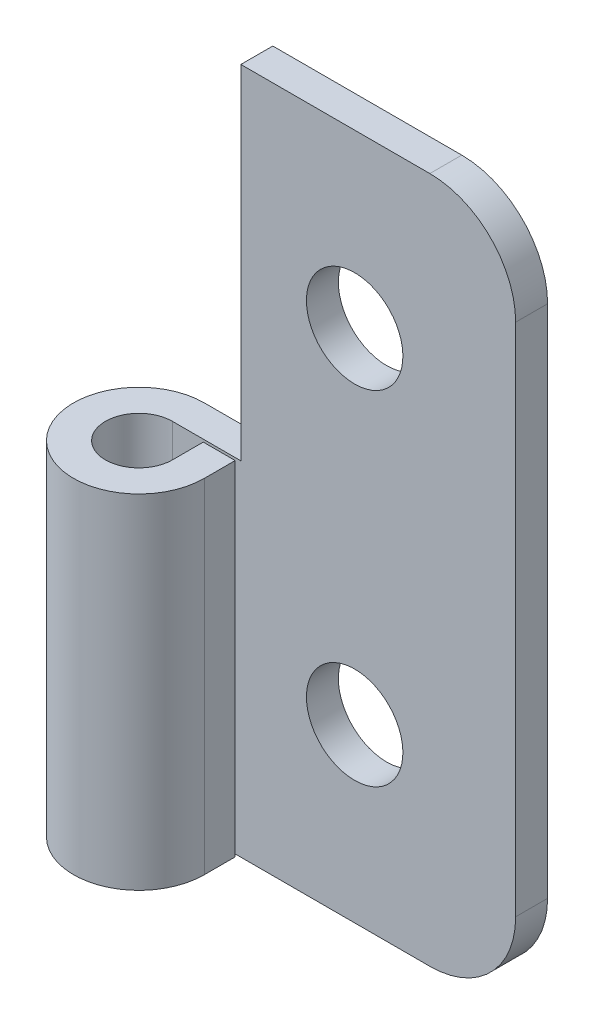
ISO-10303-21;
HEADER;
FILE_DESCRIPTION(('STEP AP214'),'2;1');
FILE_NAME('part.step','',(''),(''),'','','');
FILE_SCHEMA(('AUTOMOTIVE_DESIGN { 1 0 10303 214 1 1 1 1 }'));
ENDSEC;
DATA;
#1=APPLICATION_CONTEXT('core data for automotive mechanical design processes');
#2=APPLICATION_PROTOCOL_DEFINITION('international standard','automotive_design',2000,#1);
#3=PRODUCT_CONTEXT('',#1,'mechanical');
#4=PRODUCT('Part','Part','',(#3));
#5=PRODUCT_RELATED_PRODUCT_CATEGORY('part','',(#4));
#6=PRODUCT_DEFINITION_FORMATION('','',#4);
#7=PRODUCT_DEFINITION_CONTEXT('part definition',#1,'design');
#8=PRODUCT_DEFINITION('design','',#6,#7);
#9=PRODUCT_DEFINITION_SHAPE('','',#8);
#10=(LENGTH_UNIT() NAMED_UNIT(*) SI_UNIT(.MILLI.,.METRE.));
#11=(NAMED_UNIT(*) PLANE_ANGLE_UNIT() SI_UNIT($,.RADIAN.));
#12=(NAMED_UNIT(*) SI_UNIT($,.STERADIAN.) SOLID_ANGLE_UNIT());
#13=UNCERTAINTY_MEASURE_WITH_UNIT(LENGTH_MEASURE(1.E-05),#10,'distance_accuracy_value','');
#14=(GEOMETRIC_REPRESENTATION_CONTEXT(3) GLOBAL_UNCERTAINTY_ASSIGNED_CONTEXT((#13)) GLOBAL_UNIT_ASSIGNED_CONTEXT((#10,
#11,#12)) REPRESENTATION_CONTEXT('',''));
#15=CARTESIAN_POINT('',(0.,0.,0.));
#16=DIRECTION('',(0.,0.,1.));
#17=DIRECTION('',(1.,0.,0.));
#18=AXIS2_PLACEMENT_3D('',#15,#16,#17);
#19=CARTESIAN_POINT('',(4.8387,-25.4,2.55270000000001));
#20=DIRECTION('',(1.,0.,0.));
#21=DIRECTION('',(0.,0.,1.));
#22=AXIS2_PLACEMENT_3D('',#19,#20,#21);
#23=PLANE('',#22);
#24=DIRECTION('',(0.,0.,1.));
#25=VECTOR('',#24,1.);
#26=CARTESIAN_POINT('',(4.8387,0.,10.9397930174127));
#27=LINE('',#26,#25);
#28=CARTESIAN_POINT('',(4.8387,0.,2.55270000000001));
#29=VERTEX_POINT('',#28);
#30=CARTESIAN_POINT('',(4.8387,0.,4.8387));
#31=VERTEX_POINT('',#30);
#32=EDGE_CURVE('E298',#29,#31,#27,.T.);
#33=ORIENTED_EDGE('',*,*,#32,.T.);
#34=DIRECTION('',(0.,1.,0.));
#35=VECTOR('',#34,1.);
#36=CARTESIAN_POINT('',(4.8387,-25.4,4.8387));
#37=LINE('',#36,#35);
#38=CARTESIAN_POINT('',(4.83870000000001,-25.4,4.8387));
#39=VERTEX_POINT('',#38);
#40=EDGE_CURVE('E267',#39,#31,#37,.T.);
#41=ORIENTED_EDGE('',*,*,#40,.F.);
#42=DIRECTION('',(0.,0.,-1.));
#43=VECTOR('',#42,1.);
#44=CARTESIAN_POINT('',(4.83870000000002,-25.4,3.43572275257362));
#45=LINE('',#44,#43);
#46=CARTESIAN_POINT('',(4.83870000000001,-25.4,2.55270000000001));
#47=VERTEX_POINT('',#46);
#48=EDGE_CURVE('E232',#47,#39,#45,.F.);
#49=ORIENTED_EDGE('',*,*,#48,.F.);
#50=DIRECTION('',(0.,1.,0.));
#51=VECTOR('',#50,1.);
#52=CARTESIAN_POINT('',(4.8387,-25.4,2.55270000000001));
#53=LINE('',#52,#51);
#54=EDGE_CURVE('E276',#29,#47,#53,.F.);
#55=ORIENTED_EDGE('',*,*,#54,.F.);
#56=EDGE_LOOP('',(#33,#41,#49,#55));
#57=FACE_BOUND('',#56,.T.);
#58=ADVANCED_FACE('F41',(#57),#23,.T.);
#59=CARTESIAN_POINT('',(0.,-25.4,4.8387));
#60=DIRECTION('',(0.,1.,0.));
#61=DIRECTION('',(-1.,0.,0.));
#62=AXIS2_PLACEMENT_3D('',#59,#60,#61);
#63=CYLINDRICAL_SURFACE('',#62,4.8387);
#64=CARTESIAN_POINT('',(0.,0.,4.8387));
#65=DIRECTION('',(0.,1.,0.));
#66=DIRECTION('',(-1.,0.,0.));
#67=AXIS2_PLACEMENT_3D('',#64,#65,#66);
#68=CIRCLE('',#67,4.8387);
#69=CARTESIAN_POINT('',(0.,0.,0.));
#70=VERTEX_POINT('',#69);
#71=EDGE_CURVE('E309',#31,#70,#68,.F.);
#72=ORIENTED_EDGE('',*,*,#71,.T.);
#73=DIRECTION('',(0.,1.,0.));
#74=VECTOR('',#73,1.);
#75=CARTESIAN_POINT('',(0.,-25.4,0.));
#76=LINE('',#75,#74);
#77=CARTESIAN_POINT('',(0.,-25.4,0.));
#78=VERTEX_POINT('',#77);
#79=EDGE_CURVE('E279',#78,#70,#76,.T.);
#80=ORIENTED_EDGE('',*,*,#79,.F.);
#81=CARTESIAN_POINT('',(0.,-25.4,4.8387));
#82=DIRECTION('',(0.,1.,0.));
#83=DIRECTION('',(-1.,0.,0.));
#84=AXIS2_PLACEMENT_3D('',#81,#82,#83);
#85=CIRCLE('',#84,4.8387);
#86=EDGE_CURVE('E223',#39,#78,#85,.F.);
#87=ORIENTED_EDGE('',*,*,#86,.F.);
#88=ORIENTED_EDGE('',*,*,#40,.T.);
#89=EDGE_LOOP('',(#72,#80,#87,#88));
#90=FACE_BOUND('',#89,.T.);
#91=ADVANCED_FACE('F388',(#90),#63,.T.);
#92=CARTESIAN_POINT('',(2.4765,-25.4,4.8387));
#93=DIRECTION('',(-1.,0.,0.));
#94=DIRECTION('',(0.,-1.,0.));
#95=AXIS2_PLACEMENT_3D('',#92,#93,#94);
#96=PLANE('',#95);
#97=DIRECTION('',(0.,0.,1.));
#98=VECTOR('',#97,1.);
#99=CARTESIAN_POINT('',(2.47650000000001,0.,10.9397930174127));
#100=LINE('',#99,#98);
#101=CARTESIAN_POINT('',(2.47650000000001,0.,4.8387));
#102=VERTEX_POINT('',#101);
#103=CARTESIAN_POINT('',(2.47650000000002,0.,2.55270000000001));
#104=VERTEX_POINT('',#103);
#105=EDGE_CURVE('E172',#102,#104,#100,.F.);
#106=ORIENTED_EDGE('',*,*,#105,.T.);
#107=DIRECTION('',(0.,1.,0.));
#108=VECTOR('',#107,1.);
#109=CARTESIAN_POINT('',(2.47650000000004,-25.4,2.55270000000001));
#110=LINE('',#109,#108);
#111=CARTESIAN_POINT('',(2.47650000000002,-25.4,2.55270000000001));
#112=VERTEX_POINT('',#111);
#113=EDGE_CURVE('E266',#112,#104,#110,.T.);
#114=ORIENTED_EDGE('',*,*,#113,.F.);
#115=DIRECTION('',(0.,0.,-1.));
#116=VECTOR('',#115,1.);
#117=CARTESIAN_POINT('',(2.47650000000001,-25.4,3.43572275257362));
#118=LINE('',#117,#116);
#119=CARTESIAN_POINT('',(2.47650000000001,-25.4,4.8387));
#120=VERTEX_POINT('',#119);
#121=EDGE_CURVE('E230',#120,#112,#118,.T.);
#122=ORIENTED_EDGE('',*,*,#121,.F.);
#123=DIRECTION('',(0.,-1.,0.));
#124=VECTOR('',#123,1.);
#125=CARTESIAN_POINT('',(2.4765,-25.4,4.8387));
#126=LINE('',#125,#124);
#127=EDGE_CURVE('E262',#120,#102,#126,.F.);
#128=ORIENTED_EDGE('',*,*,#127,.T.);
#129=EDGE_LOOP('',(#106,#114,#122,#128));
#130=FACE_BOUND('',#129,.T.);
#131=ADVANCED_FACE('F378',(#130),#96,.T.);
#132=CARTESIAN_POINT('',(2.47650000000005,-25.4,2.55270000000001));
#133=DIRECTION('',(0.,0.,-1.));
#134=DIRECTION('',(0.,1.,0.));
#135=AXIS2_PLACEMENT_3D('',#132,#133,#134);
#136=PLANE('',#135);
#137=DIRECTION('',(1.,0.,0.));
#138=VECTOR('',#137,1.);
#139=CARTESIAN_POINT('',(-4.8387,0.,2.55270000000001));
#140=LINE('',#139,#138);
#141=EDGE_CURVE('E294',#104,#29,#140,.T.);
#142=ORIENTED_EDGE('',*,*,#141,.T.);
#143=ORIENTED_EDGE('',*,*,#54,.T.);
#144=DIRECTION('',(1.,0.,0.));
#145=VECTOR('',#144,1.);
#146=CARTESIAN_POINT('',(6.02577724742644,-25.4,2.55270000000001));
#147=LINE('',#146,#145);
#148=EDGE_CURVE('E258',#112,#47,#147,.T.);
#149=ORIENTED_EDGE('',*,*,#148,.F.);
#150=ORIENTED_EDGE('',*,*,#113,.T.);
#151=EDGE_LOOP('',(#142,#143,#149,#150));
#152=FACE_BOUND('',#151,.T.);
#153=ADVANCED_FACE('F334',(#152),#136,.T.);
#154=CARTESIAN_POINT('',(0.,-25.4,0.));
#155=DIRECTION('',(0.,0.,-1.));
#156=DIRECTION('',(0.,1.,0.));
#157=AXIS2_PLACEMENT_3D('',#154,#155,#156);
#158=PLANE('',#157);
#159=DIRECTION('',(0.,-1.,0.));
#160=VECTOR('',#159,1.);
#161=CARTESIAN_POINT('',(25.4,-25.4,0.));
#162=LINE('',#161,#160);
#163=CARTESIAN_POINT('',(25.4,-19.05,0.));
#164=VERTEX_POINT('',#163);
#165=CARTESIAN_POINT('',(25.4,19.05,0.));
#166=VERTEX_POINT('',#165);
#167=EDGE_CURVE('E220',#164,#166,#162,.F.);
#168=ORIENTED_EDGE('',*,*,#167,.F.);
#169=CARTESIAN_POINT('',(19.05,-19.05,0.));
#170=DIRECTION('',(0.,0.,-1.));
#171=DIRECTION('',(-1.,0.,0.));
#172=AXIS2_PLACEMENT_3D('',#169,#170,#171);
#173=CIRCLE('',#172,6.35);
#174=CARTESIAN_POINT('',(19.05,-25.4,0.));
#175=VERTEX_POINT('',#174);
#176=EDGE_CURVE('E202',#164,#175,#173,.T.);
#177=ORIENTED_EDGE('',*,*,#176,.T.);
#178=DIRECTION('',(1.,0.,0.));
#179=VECTOR('',#178,1.);
#180=CARTESIAN_POINT('',(6.02577724742644,-25.4,0.));
#181=LINE('',#180,#179);
#182=EDGE_CURVE('E218',#78,#175,#181,.T.);
#183=ORIENTED_EDGE('',*,*,#182,.F.);
#184=ORIENTED_EDGE('',*,*,#79,.T.);
#185=DIRECTION('',(1.,0.,0.));
#186=VECTOR('',#185,1.);
#187=CARTESIAN_POINT('',(-4.8387,0.,0.));
#188=LINE('',#187,#186);
#189=CARTESIAN_POINT('',(5.0673,0.,0.));
#190=VERTEX_POINT('',#189);
#191=EDGE_CURVE('E144',#70,#190,#188,.T.);
#192=ORIENTED_EDGE('',*,*,#191,.T.);
#193=DIRECTION('',(0.,1.,0.));
#194=VECTOR('',#193,1.);
#195=CARTESIAN_POINT('',(5.0673,25.4,0.));
#196=LINE('',#195,#194);
#197=CARTESIAN_POINT('',(5.0673,25.4,0.));
#198=VERTEX_POINT('',#197);
#199=EDGE_CURVE('E139',#190,#198,#196,.T.);
#200=ORIENTED_EDGE('',*,*,#199,.T.);
#201=DIRECTION('',(1.,0.,0.));
#202=VECTOR('',#201,1.);
#203=CARTESIAN_POINT('',(25.4,25.4,0.));
#204=LINE('',#203,#202);
#205=CARTESIAN_POINT('',(19.05,25.4,0.));
#206=VERTEX_POINT('',#205);
#207=EDGE_CURVE('E177',#198,#206,#204,.T.);
#208=ORIENTED_EDGE('',*,*,#207,.T.);
#209=CARTESIAN_POINT('',(19.05,19.05,0.));
#210=DIRECTION('',(0.,0.,-1.));
#211=DIRECTION('',(-1.,0.,0.));
#212=AXIS2_PLACEMENT_3D('',#209,#210,#211);
#213=CIRCLE('',#212,6.35);
#214=EDGE_CURVE('E204',#206,#166,#213,.T.);
#215=ORIENTED_EDGE('',*,*,#214,.T.);
#216=EDGE_LOOP('',(#168,#177,#183,#184,#192,#200,#208,#215));
#217=FACE_BOUND('',#216,.T.);
#218=CARTESIAN_POINT('',(13.4874,12.7,0.));
#219=DIRECTION('',(0.,0.,1.));
#220=DIRECTION('',(0.,-1.,0.));
#221=AXIS2_PLACEMENT_3D('',#218,#219,#220);
#222=CIRCLE('',#221,3.5687);
#223=CARTESIAN_POINT('',(13.4874,9.13129999999999,0.));
#224=VERTEX_POINT('',#223);
#225=EDGE_CURVE('E311',#224,#224,#222,.T.);
#226=ORIENTED_EDGE('',*,*,#225,.T.);
#227=EDGE_LOOP('',(#226));
#228=FACE_BOUND('',#227,.T.);
#229=CARTESIAN_POINT('',(13.4874,-12.7,0.));
#230=DIRECTION('',(0.,0.,1.));
#231=DIRECTION('',(0.,-1.,0.));
#232=AXIS2_PLACEMENT_3D('',#229,#230,#231);
#233=CIRCLE('',#232,3.5687);
#234=CARTESIAN_POINT('',(13.4874,-16.2687,0.));
#235=VERTEX_POINT('',#234);
#236=EDGE_CURVE('E253',#235,#235,#233,.T.);
#237=ORIENTED_EDGE('',*,*,#236,.T.);
#238=EDGE_LOOP('',(#237));
#239=FACE_BOUND('',#238,.T.);
#240=ADVANCED_FACE('F215',(#217,#228,#239),#158,.T.);
#241=CARTESIAN_POINT('',(13.4874,-12.7,-3.9066238945256));
#242=DIRECTION('',(0.,0.,1.));
#243=DIRECTION('',(0.,-1.,0.));
#244=AXIS2_PLACEMENT_3D('',#241,#242,#243);
#245=CYLINDRICAL_SURFACE('',#244,3.5687);
#246=CARTESIAN_POINT('',(13.4874,-12.7,2.3622));
#247=DIRECTION('',(0.,0.,1.));
#248=DIRECTION('',(0.,-1.,0.));
#249=AXIS2_PLACEMENT_3D('',#246,#247,#248);
#250=CIRCLE('',#249,3.5687);
#251=CARTESIAN_POINT('',(13.4874,-16.2687,2.3622));
#252=VERTEX_POINT('',#251);
#253=EDGE_CURVE('E257',#252,#252,#250,.F.);
#254=ORIENTED_EDGE('',*,*,#253,.F.);
#255=EDGE_LOOP('',(#254));
#256=FACE_BOUND('',#255,.T.);
#257=ORIENTED_EDGE('',*,*,#236,.F.);
#258=EDGE_LOOP('',(#257));
#259=FACE_BOUND('',#258,.T.);
#260=ADVANCED_FACE('F322',(#256,#259),#245,.F.);
#261=CARTESIAN_POINT('',(13.4874,12.7,-3.9066238945256));
#262=DIRECTION('',(0.,0.,1.));
#263=DIRECTION('',(0.,-1.,0.));
#264=AXIS2_PLACEMENT_3D('',#261,#262,#263);
#265=CYLINDRICAL_SURFACE('',#264,3.5687);
#266=CARTESIAN_POINT('',(13.4874,12.7,2.3622));
#267=DIRECTION('',(0.,0.,1.));
#268=DIRECTION('',(0.,-1.,0.));
#269=AXIS2_PLACEMENT_3D('',#266,#267,#268);
#270=CIRCLE('',#269,3.5687);
#271=CARTESIAN_POINT('',(13.4874,9.13129999999999,2.3622));
#272=VERTEX_POINT('',#271);
#273=EDGE_CURVE('E162',#272,#272,#270,.F.);
#274=ORIENTED_EDGE('',*,*,#273,.F.);
#275=EDGE_LOOP('',(#274));
#276=FACE_BOUND('',#275,.T.);
#277=ORIENTED_EDGE('',*,*,#225,.F.);
#278=EDGE_LOOP('',(#277));
#279=FACE_BOUND('',#278,.T.);
#280=ADVANCED_FACE('F324',(#276,#279),#265,.F.);
#281=CARTESIAN_POINT('',(25.4,25.4,2.3622));
#282=DIRECTION('',(0.,-1.,0.));
#283=DIRECTION('',(0.,0.,-1.));
#284=AXIS2_PLACEMENT_3D('',#281,#282,#283);
#285=PLANE('',#284);
#286=DIRECTION('',(1.,0.,0.));
#287=VECTOR('',#286,1.);
#288=CARTESIAN_POINT('',(25.4,25.4,2.3622));
#289=LINE('',#288,#287);
#290=CARTESIAN_POINT('',(19.05,25.4,2.3622));
#291=VERTEX_POINT('',#290);
#292=CARTESIAN_POINT('',(5.0673,25.4,2.3622));
#293=VERTEX_POINT('',#292);
#294=EDGE_CURVE('E157',#291,#293,#289,.F.);
#295=ORIENTED_EDGE('',*,*,#294,.F.);
#296=DIRECTION('',(0.,0.,1.));
#297=VECTOR('',#296,1.);
#298=CARTESIAN_POINT('',(19.05,25.4,0.));
#299=LINE('',#298,#297);
#300=EDGE_CURVE('E11',#291,#206,#299,.F.);
#301=ORIENTED_EDGE('',*,*,#300,.T.);
#302=ORIENTED_EDGE('',*,*,#207,.F.);
#303=DIRECTION('',(0.,0.,1.));
#304=VECTOR('',#303,1.);
#305=CARTESIAN_POINT('',(5.0673,25.4,10.9397930174127));
#306=LINE('',#305,#304);
#307=EDGE_CURVE('E169',#198,#293,#306,.T.);
#308=ORIENTED_EDGE('',*,*,#307,.T.);
#309=EDGE_LOOP('',(#295,#301,#302,#308));
#310=FACE_BOUND('',#309,.T.);
#311=ADVANCED_FACE('F331',(#310),#285,.F.);
#312=CARTESIAN_POINT('',(5.0673,25.4,10.9397930174127));
#313=DIRECTION('',(1.,0.,0.));
#314=DIRECTION('',(0.,1.,0.));
#315=AXIS2_PLACEMENT_3D('',#312,#313,#314);
#316=PLANE('',#315);
#317=ORIENTED_EDGE('',*,*,#199,.F.);
#318=DIRECTION('',(0.,0.,1.));
#319=VECTOR('',#318,1.);
#320=CARTESIAN_POINT('',(5.0673,0.,10.9397930174127));
#321=LINE('',#320,#319);
#322=CARTESIAN_POINT('',(5.0673,0.,2.3622));
#323=VERTEX_POINT('',#322);
#324=EDGE_CURVE('E133',#190,#323,#321,.T.);
#325=ORIENTED_EDGE('',*,*,#324,.T.);
#326=DIRECTION('',(0.,-1.,0.));
#327=VECTOR('',#326,1.);
#328=CARTESIAN_POINT('',(5.0673,-25.4,2.3622));
#329=LINE('',#328,#327);
#330=EDGE_CURVE('E138',#293,#323,#329,.T.);
#331=ORIENTED_EDGE('',*,*,#330,.F.);
#332=ORIENTED_EDGE('',*,*,#307,.F.);
#333=EDGE_LOOP('',(#317,#325,#331,#332));
#334=FACE_BOUND('',#333,.T.);
#335=ADVANCED_FACE('F135',(#334),#316,.F.);
#336=CARTESIAN_POINT('',(-4.8387,0.,10.9397930174127));
#337=DIRECTION('',(0.,-1.,0.));
#338=DIRECTION('',(1.,0.,0.));
#339=AXIS2_PLACEMENT_3D('',#336,#337,#338);
#340=PLANE('',#339);
#341=ORIENTED_EDGE('',*,*,#191,.F.);
#342=ORIENTED_EDGE('',*,*,#71,.F.);
#343=ORIENTED_EDGE('',*,*,#32,.F.);
#344=ORIENTED_EDGE('',*,*,#141,.F.);
#345=ORIENTED_EDGE('',*,*,#105,.F.);
#346=CARTESIAN_POINT('',(0.,0.,4.8387));
#347=DIRECTION('',(0.,1.,0.));
#348=DIRECTION('',(-1.,0.,0.));
#349=AXIS2_PLACEMENT_3D('',#346,#347,#348);
#350=CIRCLE('',#349,2.4765);
#351=CARTESIAN_POINT('',(0.,0.,2.3622));
#352=VERTEX_POINT('',#351);
#353=EDGE_CURVE('E143',#102,#352,#350,.F.);
#354=ORIENTED_EDGE('',*,*,#353,.T.);
#355=DIRECTION('',(1.,0.,0.));
#356=VECTOR('',#355,1.);
#357=CARTESIAN_POINT('',(25.4,0.,2.3622));
#358=LINE('',#357,#356);
#359=EDGE_CURVE('E147',#323,#352,#358,.F.);
#360=ORIENTED_EDGE('',*,*,#359,.F.);
#361=ORIENTED_EDGE('',*,*,#324,.F.);
#362=EDGE_LOOP('',(#341,#342,#343,#344,#345,#354,#360,#361));
#363=FACE_BOUND('',#362,.T.);
#364=ADVANCED_FACE('F148',(#363),#340,.F.);
#365=CARTESIAN_POINT('',(0.,-25.4,4.8387));
#366=DIRECTION('',(0.,1.,0.));
#367=DIRECTION('',(-1.,0.,0.));
#368=AXIS2_PLACEMENT_3D('',#365,#366,#367);
#369=CYLINDRICAL_SURFACE('',#368,2.4765);
#370=CARTESIAN_POINT('',(0.,-25.4,4.8387));
#371=DIRECTION('',(0.,1.,0.));
#372=DIRECTION('',(-1.,0.,0.));
#373=AXIS2_PLACEMENT_3D('',#370,#371,#372);
#374=CIRCLE('',#373,2.4765);
#375=CARTESIAN_POINT('',(0.,-25.4,2.3622));
#376=VERTEX_POINT('',#375);
#377=EDGE_CURVE('E225',#376,#120,#374,.T.);
#378=ORIENTED_EDGE('',*,*,#377,.F.);
#379=DIRECTION('',(0.,-1.,0.));
#380=VECTOR('',#379,1.);
#381=CARTESIAN_POINT('',(0.,-25.4,2.3622));
#382=LINE('',#381,#380);
#383=EDGE_CURVE('E153',#352,#376,#382,.T.);
#384=ORIENTED_EDGE('',*,*,#383,.F.);
#385=ORIENTED_EDGE('',*,*,#353,.F.);
#386=ORIENTED_EDGE('',*,*,#127,.F.);
#387=EDGE_LOOP('',(#378,#384,#385,#386));
#388=FACE_BOUND('',#387,.T.);
#389=ADVANCED_FACE('F347',(#388),#369,.F.);
#390=CARTESIAN_POINT('',(6.02577724742644,-25.4,3.43572275257362));
#391=DIRECTION('',(0.,-1.,0.));
#392=DIRECTION('',(0.,0.,-1.));
#393=AXIS2_PLACEMENT_3D('',#390,#391,#392);
#394=PLANE('',#393);
#395=ORIENTED_EDGE('',*,*,#182,.T.);
#396=DIRECTION('',(0.,0.,-1.));
#397=VECTOR('',#396,1.);
#398=CARTESIAN_POINT('',(19.05,-25.4,3.43572275257362));
#399=LINE('',#398,#397);
#400=CARTESIAN_POINT('',(19.05,-25.4,2.3622));
#401=VERTEX_POINT('',#400);
#402=EDGE_CURVE('E65',#175,#401,#399,.F.);
#403=ORIENTED_EDGE('',*,*,#402,.T.);
#404=DIRECTION('',(1.,0.,0.));
#405=VECTOR('',#404,1.);
#406=CARTESIAN_POINT('',(25.4,-25.4,2.3622));
#407=LINE('',#406,#405);
#408=EDGE_CURVE('E187',#376,#401,#407,.T.);
#409=ORIENTED_EDGE('',*,*,#408,.F.);
#410=ORIENTED_EDGE('',*,*,#377,.T.);
#411=ORIENTED_EDGE('',*,*,#121,.T.);
#412=ORIENTED_EDGE('',*,*,#148,.T.);
#413=ORIENTED_EDGE('',*,*,#48,.T.);
#414=ORIENTED_EDGE('',*,*,#86,.T.);
#415=EDGE_LOOP('',(#395,#403,#409,#410,#411,#412,#413,#414));
#416=FACE_BOUND('',#415,.T.);
#417=ADVANCED_FACE('F221',(#416),#394,.T.);
#418=CARTESIAN_POINT('',(25.4,-25.4,0.));
#419=DIRECTION('',(1.,0.,0.));
#420=DIRECTION('',(0.,0.,1.));
#421=AXIS2_PLACEMENT_3D('',#418,#419,#420);
#422=PLANE('',#421);
#423=DIRECTION('',(0.,-1.,0.));
#424=VECTOR('',#423,1.);
#425=CARTESIAN_POINT('',(25.4,-25.4,2.3622));
#426=LINE('',#425,#424);
#427=CARTESIAN_POINT('',(25.4,-19.05,2.3622));
#428=VERTEX_POINT('',#427);
#429=CARTESIAN_POINT('',(25.4,19.05,2.3622));
#430=VERTEX_POINT('',#429);
#431=EDGE_CURVE('E186',#428,#430,#426,.F.);
#432=ORIENTED_EDGE('',*,*,#431,.F.);
#433=DIRECTION('',(0.,0.,-1.));
#434=VECTOR('',#433,1.);
#435=CARTESIAN_POINT('',(25.4,-19.05,0.));
#436=LINE('',#435,#434);
#437=EDGE_CURVE('E195',#428,#164,#436,.T.);
#438=ORIENTED_EDGE('',*,*,#437,.T.);
#439=ORIENTED_EDGE('',*,*,#167,.T.);
#440=DIRECTION('',(0.,0.,1.));
#441=VECTOR('',#440,1.);
#442=CARTESIAN_POINT('',(25.4,19.05,2.3622));
#443=LINE('',#442,#441);
#444=EDGE_CURVE('E198',#166,#430,#443,.T.);
#445=ORIENTED_EDGE('',*,*,#444,.T.);
#446=EDGE_LOOP('',(#432,#438,#439,#445));
#447=FACE_BOUND('',#446,.T.);
#448=ADVANCED_FACE('F193',(#447),#422,.T.);
#449=CARTESIAN_POINT('',(25.4,-25.4,2.3622));
#450=DIRECTION('',(0.,0.,1.));
#451=DIRECTION('',(0.,-1.,0.));
#452=AXIS2_PLACEMENT_3D('',#449,#450,#451);
#453=PLANE('',#452);
#454=ORIENTED_EDGE('',*,*,#408,.T.);
#455=CARTESIAN_POINT('',(19.05,-19.05,2.3622));
#456=DIRECTION('',(0.,0.,1.));
#457=DIRECTION('',(1.,0.,0.));
#458=AXIS2_PLACEMENT_3D('',#455,#456,#457);
#459=CIRCLE('',#458,6.35);
#460=EDGE_CURVE('E50',#401,#428,#459,.T.);
#461=ORIENTED_EDGE('',*,*,#460,.T.);
#462=ORIENTED_EDGE('',*,*,#431,.T.);
#463=CARTESIAN_POINT('',(19.05,19.05,2.3622));
#464=DIRECTION('',(0.,0.,1.));
#465=DIRECTION('',(1.,0.,0.));
#466=AXIS2_PLACEMENT_3D('',#463,#464,#465);
#467=CIRCLE('',#466,6.35);
#468=EDGE_CURVE('E57',#430,#291,#467,.T.);
#469=ORIENTED_EDGE('',*,*,#468,.T.);
#470=ORIENTED_EDGE('',*,*,#294,.T.);
#471=ORIENTED_EDGE('',*,*,#330,.T.);
#472=ORIENTED_EDGE('',*,*,#359,.T.);
#473=ORIENTED_EDGE('',*,*,#383,.T.);
#474=EDGE_LOOP('',(#454,#461,#462,#469,#470,#471,#472,#473));
#475=FACE_BOUND('',#474,.T.);
#476=ORIENTED_EDGE('',*,*,#273,.T.);
#477=EDGE_LOOP('',(#476));
#478=FACE_BOUND('',#477,.T.);
#479=ORIENTED_EDGE('',*,*,#253,.T.);
#480=EDGE_LOOP('',(#479));
#481=FACE_BOUND('',#480,.T.);
#482=ADVANCED_FACE('F155',(#475,#478,#481),#453,.T.);
#483=CARTESIAN_POINT('',(19.05,-19.05,0.));
#484=DIRECTION('',(0.,0.,-1.));
#485=DIRECTION('',(-1.,0.,0.));
#486=AXIS2_PLACEMENT_3D('',#483,#484,#485);
#487=CYLINDRICAL_SURFACE('',#486,6.35);
#488=ORIENTED_EDGE('',*,*,#460,.F.);
#489=ORIENTED_EDGE('',*,*,#402,.F.);
#490=ORIENTED_EDGE('',*,*,#176,.F.);
#491=ORIENTED_EDGE('',*,*,#437,.F.);
#492=EDGE_LOOP('',(#488,#489,#490,#491));
#493=FACE_BOUND('',#492,.T.);
#494=ADVANCED_FACE('F201',(#493),#487,.T.);
#495=CARTESIAN_POINT('',(19.05,19.05,0.));
#496=DIRECTION('',(0.,0.,-1.));
#497=DIRECTION('',(-1.,0.,0.));
#498=AXIS2_PLACEMENT_3D('',#495,#496,#497);
#499=CYLINDRICAL_SURFACE('',#498,6.35);
#500=ORIENTED_EDGE('',*,*,#214,.F.);
#501=ORIENTED_EDGE('',*,*,#300,.F.);
#502=ORIENTED_EDGE('',*,*,#468,.F.);
#503=ORIENTED_EDGE('',*,*,#444,.F.);
#504=EDGE_LOOP('',(#500,#501,#502,#503));
#505=FACE_BOUND('',#504,.T.);
#506=ADVANCED_FACE('F43',(#505),#499,.T.);
#507=CLOSED_SHELL('',(#58,#91,#131,#153,#240,#260,#280,#311,#335,#364,#389,#417,#448,#482,#494,#506));
#508=MANIFOLD_SOLID_BREP('B2',#507);
#509=ADVANCED_BREP_SHAPE_REPRESENTATION('',(#18,#508),#14);
#510=SHAPE_DEFINITION_REPRESENTATION(#9,#509);
ENDSEC;
END-ISO-10303-21;
